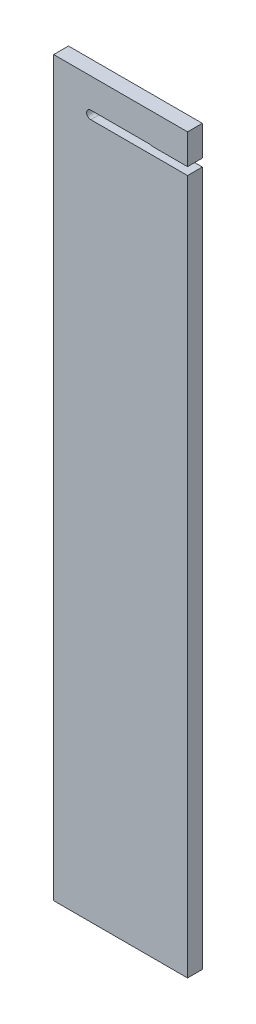
ISO-10303-21;
HEADER;
FILE_DESCRIPTION(('STEP AP214'),'2;1');
FILE_NAME('part.step','',(''),(''),'','','');
FILE_SCHEMA(('AUTOMOTIVE_DESIGN { 1 0 10303 214 1 1 1 1 }'));
ENDSEC;
DATA;
#1=APPLICATION_CONTEXT('core data for automotive mechanical design processes');
#2=APPLICATION_PROTOCOL_DEFINITION('international standard','automotive_design',2000,#1);
#3=PRODUCT_CONTEXT('',#1,'mechanical');
#4=PRODUCT('Part','Part','',(#3));
#5=PRODUCT_RELATED_PRODUCT_CATEGORY('part','',(#4));
#6=PRODUCT_DEFINITION_FORMATION('','',#4);
#7=PRODUCT_DEFINITION_CONTEXT('part definition',#1,'design');
#8=PRODUCT_DEFINITION('design','',#6,#7);
#9=PRODUCT_DEFINITION_SHAPE('','',#8);
#10=(LENGTH_UNIT() NAMED_UNIT(*) SI_UNIT(.MILLI.,.METRE.));
#11=(NAMED_UNIT(*) PLANE_ANGLE_UNIT() SI_UNIT($,.RADIAN.));
#12=(NAMED_UNIT(*) SI_UNIT($,.STERADIAN.) SOLID_ANGLE_UNIT());
#13=UNCERTAINTY_MEASURE_WITH_UNIT(LENGTH_MEASURE(1.E-05),#10,'distance_accuracy_value','');
#14=(GEOMETRIC_REPRESENTATION_CONTEXT(3) GLOBAL_UNCERTAINTY_ASSIGNED_CONTEXT((#13)) GLOBAL_UNIT_ASSIGNED_CONTEXT((#10,
#11,#12)) REPRESENTATION_CONTEXT('',''));
#15=CARTESIAN_POINT('',(0.,0.,0.));
#16=DIRECTION('',(0.,0.,1.));
#17=DIRECTION('',(1.,0.,0.));
#18=AXIS2_PLACEMENT_3D('',#15,#16,#17);
#19=CARTESIAN_POINT('',(28.75,0.,6.35));
#20=DIRECTION('',(1.,0.,0.));
#21=DIRECTION('',(0.,0.,-1.));
#22=AXIS2_PLACEMENT_3D('',#19,#20,#21);
#23=PLANE('',#22);
#24=DIRECTION('',(0.,-1.,0.));
#25=VECTOR('',#24,1.);
#26=CARTESIAN_POINT('',(28.75,0.,0.));
#27=LINE('',#26,#25);
#28=CARTESIAN_POINT('',(28.75,149.225,0.));
#29=VERTEX_POINT('',#28);
#30=CARTESIAN_POINT('',(28.75,-149.225,0.));
#31=VERTEX_POINT('',#30);
#32=EDGE_CURVE('E115',#29,#31,#27,.T.);
#33=ORIENTED_EDGE('',*,*,#32,.F.);
#34=DIRECTION('',(0.,0.,-1.));
#35=VECTOR('',#34,1.);
#36=CARTESIAN_POINT('',(28.75,149.225,6.35));
#37=LINE('',#36,#35);
#38=CARTESIAN_POINT('',(28.75,149.225,6.35));
#39=VERTEX_POINT('',#38);
#40=EDGE_CURVE('E111',#39,#29,#37,.T.);
#41=ORIENTED_EDGE('',*,*,#40,.F.);
#42=DIRECTION('',(0.,-1.,0.));
#43=VECTOR('',#42,1.);
#44=CARTESIAN_POINT('',(28.75,0.,6.35));
#45=LINE('',#44,#43);
#46=CARTESIAN_POINT('',(28.75,-149.225,6.35));
#47=VERTEX_POINT('',#46);
#48=EDGE_CURVE('E113',#39,#47,#45,.T.);
#49=ORIENTED_EDGE('',*,*,#48,.T.);
#50=DIRECTION('',(0.,0.,-1.));
#51=VECTOR('',#50,1.);
#52=CARTESIAN_POINT('',(28.75,-149.225,6.35));
#53=LINE('',#52,#51);
#54=EDGE_CURVE('E151',#47,#31,#53,.T.);
#55=ORIENTED_EDGE('',*,*,#54,.T.);
#56=EDGE_LOOP('',(#33,#41,#49,#55));
#57=FACE_BOUND('',#56,.T.);
#58=ADVANCED_FACE('F34',(#57),#23,.T.);
#59=CARTESIAN_POINT('',(0.,149.225,6.35));
#60=DIRECTION('',(0.,1.,0.));
#61=DIRECTION('',(0.,0.,1.));
#62=AXIS2_PLACEMENT_3D('',#59,#60,#61);
#63=PLANE('',#62);
#64=DIRECTION('',(1.,0.,0.));
#65=VECTOR('',#64,1.);
#66=CARTESIAN_POINT('',(0.,149.225,0.));
#67=LINE('',#66,#65);
#68=CARTESIAN_POINT('',(-12.827,149.225,0.));
#69=VERTEX_POINT('',#68);
#70=EDGE_CURVE('E153',#69,#29,#67,.T.);
#71=ORIENTED_EDGE('',*,*,#70,.F.);
#72=DIRECTION('',(0.,0.,-1.));
#73=VECTOR('',#72,1.);
#74=CARTESIAN_POINT('',(-12.827,149.225,6.35));
#75=LINE('',#74,#73);
#76=CARTESIAN_POINT('',(-12.827,149.225,6.35));
#77=VERTEX_POINT('',#76);
#78=EDGE_CURVE('E121',#77,#69,#75,.T.);
#79=ORIENTED_EDGE('',*,*,#78,.F.);
#80=DIRECTION('',(1.,0.,0.));
#81=VECTOR('',#80,1.);
#82=CARTESIAN_POINT('',(0.,149.225,6.35));
#83=LINE('',#82,#81);
#84=EDGE_CURVE('E126',#77,#39,#83,.T.);
#85=ORIENTED_EDGE('',*,*,#84,.T.);
#86=ORIENTED_EDGE('',*,*,#40,.T.);
#87=EDGE_LOOP('',(#71,#79,#85,#86));
#88=FACE_BOUND('',#87,.T.);
#89=ADVANCED_FACE('F133',(#88),#63,.T.);
#90=CARTESIAN_POINT('',(-12.827,151.003,6.35));
#91=DIRECTION('',(0.,0.,-1.));
#92=DIRECTION('',(-1.,0.,0.));
#93=AXIS2_PLACEMENT_3D('',#90,#91,#92);
#94=CYLINDRICAL_SURFACE('',#93,1.778);
#95=CARTESIAN_POINT('',(-12.827,151.003,0.));
#96=DIRECTION('',(0.,0.,1.));
#97=DIRECTION('',(1.,0.,0.));
#98=AXIS2_PLACEMENT_3D('',#95,#96,#97);
#99=CIRCLE('',#98,1.778);
#100=CARTESIAN_POINT('',(-12.827,152.781,0.));
#101=VERTEX_POINT('',#100);
#102=EDGE_CURVE('E155',#101,#69,#99,.T.);
#103=ORIENTED_EDGE('',*,*,#102,.F.);
#104=DIRECTION('',(0.,0.,-1.));
#105=VECTOR('',#104,1.);
#106=CARTESIAN_POINT('',(-12.827,152.781,6.35));
#107=LINE('',#106,#105);
#108=CARTESIAN_POINT('',(-12.827,152.781,6.35));
#109=VERTEX_POINT('',#108);
#110=EDGE_CURVE('E186',#109,#101,#107,.T.);
#111=ORIENTED_EDGE('',*,*,#110,.F.);
#112=CARTESIAN_POINT('',(-12.827,151.003,6.35));
#113=DIRECTION('',(0.,0.,1.));
#114=DIRECTION('',(1.,0.,0.));
#115=AXIS2_PLACEMENT_3D('',#112,#113,#114);
#116=CIRCLE('',#115,1.778);
#117=EDGE_CURVE('E134',#109,#77,#116,.T.);
#118=ORIENTED_EDGE('',*,*,#117,.T.);
#119=ORIENTED_EDGE('',*,*,#78,.T.);
#120=EDGE_LOOP('',(#103,#111,#118,#119));
#121=FACE_BOUND('',#120,.T.);
#122=ADVANCED_FACE('F216',(#121),#94,.F.);
#123=CARTESIAN_POINT('',(0.,152.781,6.35));
#124=DIRECTION('',(0.,-1.,0.));
#125=DIRECTION('',(0.,0.,-1.));
#126=AXIS2_PLACEMENT_3D('',#123,#124,#125);
#127=PLANE('',#126);
#128=DIRECTION('',(-1.,0.,0.));
#129=VECTOR('',#128,1.);
#130=CARTESIAN_POINT('',(0.,152.781,0.));
#131=LINE('',#130,#129);
#132=CARTESIAN_POINT('',(12.827,152.781,0.));
#133=VERTEX_POINT('',#132);
#134=EDGE_CURVE('E158',#133,#101,#131,.T.);
#135=ORIENTED_EDGE('',*,*,#134,.F.);
#136=DIRECTION('',(0.,0.,-1.));
#137=VECTOR('',#136,1.);
#138=CARTESIAN_POINT('',(12.827,152.781,6.35));
#139=LINE('',#138,#137);
#140=CARTESIAN_POINT('',(12.827,152.781,6.35));
#141=VERTEX_POINT('',#140);
#142=EDGE_CURVE('E184',#141,#133,#139,.T.);
#143=ORIENTED_EDGE('',*,*,#142,.F.);
#144=DIRECTION('',(-1.,0.,0.));
#145=VECTOR('',#144,1.);
#146=CARTESIAN_POINT('',(0.,152.781,6.35));
#147=LINE('',#146,#145);
#148=EDGE_CURVE('E136',#141,#109,#147,.T.);
#149=ORIENTED_EDGE('',*,*,#148,.T.);
#150=ORIENTED_EDGE('',*,*,#110,.T.);
#151=EDGE_LOOP('',(#135,#143,#149,#150));
#152=FACE_BOUND('',#151,.T.);
#153=ADVANCED_FACE('F195',(#152),#127,.T.);
#154=CARTESIAN_POINT('',(0.,152.527,6.35));
#155=DIRECTION('',(0.,-1.,0.));
#156=DIRECTION('',(0.,0.,-1.));
#157=AXIS2_PLACEMENT_3D('',#154,#155,#156);
#158=PLANE('',#157);
#159=DIRECTION('',(-1.,0.,0.));
#160=VECTOR('',#159,1.);
#161=CARTESIAN_POINT('',(0.,152.527,6.35));
#162=LINE('',#161,#160);
#163=CARTESIAN_POINT('',(28.75,152.527,6.35));
#164=VERTEX_POINT('',#163);
#165=CARTESIAN_POINT('',(14.0713407893338,152.527,6.35));
#166=VERTEX_POINT('',#165);
#167=EDGE_CURVE('E141',#164,#166,#162,.T.);
#168=ORIENTED_EDGE('',*,*,#167,.T.);
#169=DIRECTION('',(0.,0.,-1.));
#170=VECTOR('',#169,1.);
#171=CARTESIAN_POINT('',(14.0713407893338,152.527,0.));
#172=LINE('',#171,#170);
#173=CARTESIAN_POINT('',(14.0713407893338,152.527,0.));
#174=VERTEX_POINT('',#173);
#175=EDGE_CURVE('E120',#166,#174,#172,.T.);
#176=ORIENTED_EDGE('',*,*,#175,.T.);
#177=DIRECTION('',(-1.,0.,0.));
#178=VECTOR('',#177,1.);
#179=CARTESIAN_POINT('',(0.,152.527,0.));
#180=LINE('',#179,#178);
#181=CARTESIAN_POINT('',(28.75,152.527,0.));
#182=VERTEX_POINT('',#181);
#183=EDGE_CURVE('E161',#182,#174,#180,.T.);
#184=ORIENTED_EDGE('',*,*,#183,.F.);
#185=DIRECTION('',(0.,0.,-1.));
#186=VECTOR('',#185,1.);
#187=CARTESIAN_POINT('',(28.75,152.527,6.35));
#188=LINE('',#187,#186);
#189=EDGE_CURVE('E182',#164,#182,#188,.T.);
#190=ORIENTED_EDGE('',*,*,#189,.F.);
#191=EDGE_LOOP('',(#168,#176,#184,#190));
#192=FACE_BOUND('',#191,.T.);
#193=ADVANCED_FACE('F198',(#192),#158,.T.);
#194=CARTESIAN_POINT('',(28.75,0.,6.35));
#195=DIRECTION('',(-1.,0.,0.));
#196=DIRECTION('',(0.,0.,1.));
#197=AXIS2_PLACEMENT_3D('',#194,#195,#196);
#198=PLANE('',#197);
#199=DIRECTION('',(0.,1.,0.));
#200=VECTOR('',#199,1.);
#201=CARTESIAN_POINT('',(28.75,0.,0.));
#202=LINE('',#201,#200);
#203=CARTESIAN_POINT('',(28.75,165.481,0.));
#204=VERTEX_POINT('',#203);
#205=EDGE_CURVE('E164',#182,#204,#202,.T.);
#206=ORIENTED_EDGE('',*,*,#205,.T.);
#207=DIRECTION('',(0.,0.,-1.));
#208=VECTOR('',#207,1.);
#209=CARTESIAN_POINT('',(28.75,165.481,6.35));
#210=LINE('',#209,#208);
#211=CARTESIAN_POINT('',(28.75,165.481,6.35));
#212=VERTEX_POINT('',#211);
#213=EDGE_CURVE('E180',#212,#204,#210,.T.);
#214=ORIENTED_EDGE('',*,*,#213,.F.);
#215=DIRECTION('',(0.,1.,0.));
#216=VECTOR('',#215,1.);
#217=CARTESIAN_POINT('',(28.75,0.,6.35));
#218=LINE('',#217,#216);
#219=EDGE_CURVE('E143',#164,#212,#218,.T.);
#220=ORIENTED_EDGE('',*,*,#219,.F.);
#221=ORIENTED_EDGE('',*,*,#189,.T.);
#222=EDGE_LOOP('',(#206,#214,#220,#221));
#223=FACE_BOUND('',#222,.T.);
#224=ADVANCED_FACE('F203',(#223),#198,.F.);
#225=CARTESIAN_POINT('',(0.,165.481,6.35));
#226=DIRECTION('',(0.,1.,0.));
#227=DIRECTION('',(0.,0.,1.));
#228=AXIS2_PLACEMENT_3D('',#225,#226,#227);
#229=PLANE('',#228);
#230=DIRECTION('',(1.,0.,0.));
#231=VECTOR('',#230,1.);
#232=CARTESIAN_POINT('',(0.,165.481,0.));
#233=LINE('',#232,#231);
#234=CARTESIAN_POINT('',(-28.75,165.481,0.));
#235=VERTEX_POINT('',#234);
#236=EDGE_CURVE('E167',#235,#204,#233,.T.);
#237=ORIENTED_EDGE('',*,*,#236,.F.);
#238=DIRECTION('',(0.,0.,-1.));
#239=VECTOR('',#238,1.);
#240=CARTESIAN_POINT('',(-28.75,165.481,6.35));
#241=LINE('',#240,#239);
#242=CARTESIAN_POINT('',(-28.75,165.481,6.35));
#243=VERTEX_POINT('',#242);
#244=EDGE_CURVE('E178',#243,#235,#241,.T.);
#245=ORIENTED_EDGE('',*,*,#244,.F.);
#246=DIRECTION('',(1.,0.,0.));
#247=VECTOR('',#246,1.);
#248=CARTESIAN_POINT('',(0.,165.481,6.35));
#249=LINE('',#248,#247);
#250=EDGE_CURVE('E145',#243,#212,#249,.T.);
#251=ORIENTED_EDGE('',*,*,#250,.T.);
#252=ORIENTED_EDGE('',*,*,#213,.T.);
#253=EDGE_LOOP('',(#237,#245,#251,#252));
#254=FACE_BOUND('',#253,.T.);
#255=ADVANCED_FACE('F206',(#254),#229,.T.);
#256=CARTESIAN_POINT('',(-28.75,0.,6.35));
#257=DIRECTION('',(1.,0.,0.));
#258=DIRECTION('',(0.,0.,-1.));
#259=AXIS2_PLACEMENT_3D('',#256,#257,#258);
#260=PLANE('',#259);
#261=DIRECTION('',(0.,-1.,0.));
#262=VECTOR('',#261,1.);
#263=CARTESIAN_POINT('',(-28.75,0.,0.));
#264=LINE('',#263,#262);
#265=CARTESIAN_POINT('',(-28.75,-149.225,0.));
#266=VERTEX_POINT('',#265);
#267=EDGE_CURVE('E170',#235,#266,#264,.T.);
#268=ORIENTED_EDGE('',*,*,#267,.T.);
#269=DIRECTION('',(0.,0.,-1.));
#270=VECTOR('',#269,1.);
#271=CARTESIAN_POINT('',(-28.75,-149.225,6.35));
#272=LINE('',#271,#270);
#273=CARTESIAN_POINT('',(-28.75,-149.225,6.35));
#274=VERTEX_POINT('',#273);
#275=EDGE_CURVE('E175',#274,#266,#272,.T.);
#276=ORIENTED_EDGE('',*,*,#275,.F.);
#277=DIRECTION('',(0.,-1.,0.));
#278=VECTOR('',#277,1.);
#279=CARTESIAN_POINT('',(-28.75,0.,6.35));
#280=LINE('',#279,#278);
#281=EDGE_CURVE('E148',#243,#274,#280,.T.);
#282=ORIENTED_EDGE('',*,*,#281,.F.);
#283=ORIENTED_EDGE('',*,*,#244,.T.);
#284=EDGE_LOOP('',(#268,#276,#282,#283));
#285=FACE_BOUND('',#284,.T.);
#286=ADVANCED_FACE('F211',(#285),#260,.F.);
#287=CARTESIAN_POINT('',(0.,-149.225,6.35));
#288=DIRECTION('',(0.,1.,0.));
#289=DIRECTION('',(0.,0.,1.));
#290=AXIS2_PLACEMENT_3D('',#287,#288,#289);
#291=PLANE('',#290);
#292=DIRECTION('',(1.,0.,0.));
#293=VECTOR('',#292,1.);
#294=CARTESIAN_POINT('',(0.,-149.225,0.));
#295=LINE('',#294,#293);
#296=EDGE_CURVE('E131',#266,#31,#295,.T.);
#297=ORIENTED_EDGE('',*,*,#296,.T.);
#298=ORIENTED_EDGE('',*,*,#54,.F.);
#299=DIRECTION('',(1.,0.,0.));
#300=VECTOR('',#299,1.);
#301=CARTESIAN_POINT('',(0.,-149.225,6.35));
#302=LINE('',#301,#300);
#303=EDGE_CURVE('E129',#274,#47,#302,.T.);
#304=ORIENTED_EDGE('',*,*,#303,.F.);
#305=ORIENTED_EDGE('',*,*,#275,.T.);
#306=EDGE_LOOP('',(#297,#298,#304,#305));
#307=FACE_BOUND('',#306,.T.);
#308=ADVANCED_FACE('F214',(#307),#291,.F.);
#309=CARTESIAN_POINT('',(0.,0.,6.35));
#310=DIRECTION('',(0.,0.,1.));
#311=DIRECTION('',(1.,0.,0.));
#312=AXIS2_PLACEMENT_3D('',#309,#310,#311);
#313=PLANE('',#312);
#314=ORIENTED_EDGE('',*,*,#148,.F.);
#315=CARTESIAN_POINT('',(14.0713407893338,155.702,6.35));
#316=DIRECTION('',(0.,0.,1.));
#317=DIRECTION('',(1.,0.,0.));
#318=AXIS2_PLACEMENT_3D('',#315,#316,#317);
#319=CIRCLE('',#318,3.175);
#320=EDGE_CURVE('E11',#141,#166,#319,.T.);
#321=ORIENTED_EDGE('',*,*,#320,.T.);
#322=ORIENTED_EDGE('',*,*,#167,.F.);
#323=ORIENTED_EDGE('',*,*,#219,.T.);
#324=ORIENTED_EDGE('',*,*,#250,.F.);
#325=ORIENTED_EDGE('',*,*,#281,.T.);
#326=ORIENTED_EDGE('',*,*,#303,.T.);
#327=ORIENTED_EDGE('',*,*,#48,.F.);
#328=ORIENTED_EDGE('',*,*,#84,.F.);
#329=ORIENTED_EDGE('',*,*,#117,.F.);
#330=EDGE_LOOP('',(#314,#321,#322,#323,#324,#325,#326,#327,#328,#329));
#331=FACE_BOUND('',#330,.T.);
#332=ADVANCED_FACE('F124',(#331),#313,.T.);
#333=CARTESIAN_POINT('',(0.,0.,0.));
#334=DIRECTION('',(0.,0.,1.));
#335=DIRECTION('',(1.,0.,0.));
#336=AXIS2_PLACEMENT_3D('',#333,#334,#335);
#337=PLANE('',#336);
#338=ORIENTED_EDGE('',*,*,#183,.T.);
#339=CARTESIAN_POINT('',(14.0713407893338,155.702,0.));
#340=DIRECTION('',(0.,0.,1.));
#341=DIRECTION('',(1.,0.,0.));
#342=AXIS2_PLACEMENT_3D('',#339,#340,#341);
#343=CIRCLE('',#342,3.175);
#344=EDGE_CURVE('E42',#174,#133,#343,.F.);
#345=ORIENTED_EDGE('',*,*,#344,.T.);
#346=ORIENTED_EDGE('',*,*,#134,.T.);
#347=ORIENTED_EDGE('',*,*,#102,.T.);
#348=ORIENTED_EDGE('',*,*,#70,.T.);
#349=ORIENTED_EDGE('',*,*,#32,.T.);
#350=ORIENTED_EDGE('',*,*,#296,.F.);
#351=ORIENTED_EDGE('',*,*,#267,.F.);
#352=ORIENTED_EDGE('',*,*,#236,.T.);
#353=ORIENTED_EDGE('',*,*,#205,.F.);
#354=EDGE_LOOP('',(#338,#345,#346,#347,#348,#349,#350,#351,#352,#353));
#355=FACE_BOUND('',#354,.T.);
#356=ADVANCED_FACE('F191',(#355),#337,.F.);
#357=CARTESIAN_POINT('',(14.0713407893338,155.702,6.35));
#358=DIRECTION('',(0.,0.,1.));
#359=DIRECTION('',(1.,0.,0.));
#360=AXIS2_PLACEMENT_3D('',#357,#358,#359);
#361=CYLINDRICAL_SURFACE('',#360,3.175);
#362=ORIENTED_EDGE('',*,*,#320,.F.);
#363=ORIENTED_EDGE('',*,*,#142,.T.);
#364=ORIENTED_EDGE('',*,*,#344,.F.);
#365=ORIENTED_EDGE('',*,*,#175,.F.);
#366=EDGE_LOOP('',(#362,#363,#364,#365));
#367=FACE_BOUND('',#366,.T.);
#368=ADVANCED_FACE('F36',(#367),#361,.T.);
#369=CLOSED_SHELL('',(#58,#89,#122,#153,#193,#224,#255,#286,#308,#332,#356,#368));
#370=MANIFOLD_SOLID_BREP('B2',#369);
#371=ADVANCED_BREP_SHAPE_REPRESENTATION('',(#18,#370),#14);
#372=SHAPE_DEFINITION_REPRESENTATION(#9,#371);
ENDSEC;
END-ISO-10303-21;
